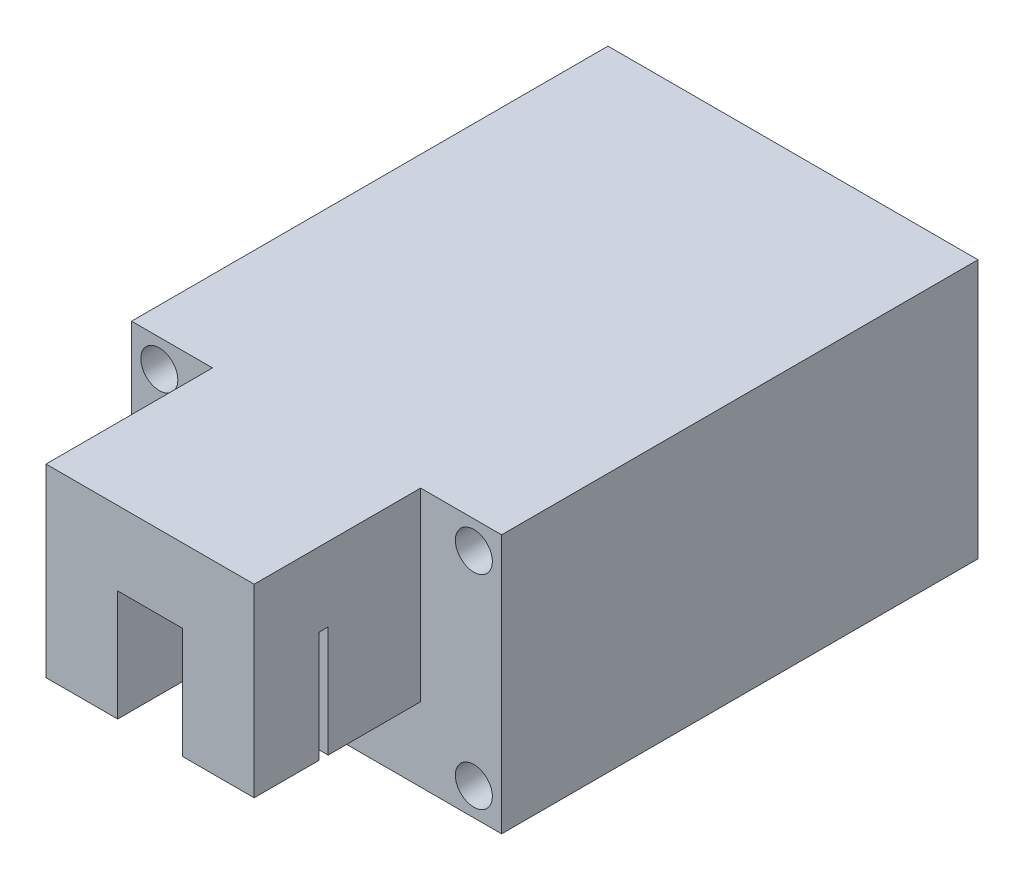
ISO-10303-21;
HEADER;
FILE_DESCRIPTION(('STEP AP214'),'2;1');
FILE_NAME('part.step','',(''),(''),'','','');
FILE_SCHEMA(('AUTOMOTIVE_DESIGN { 1 0 10303 214 1 1 1 1 }'));
ENDSEC;
DATA;
#1=APPLICATION_CONTEXT('core data for automotive mechanical design processes');
#2=APPLICATION_PROTOCOL_DEFINITION('international standard','automotive_design',2000,#1);
#3=PRODUCT_CONTEXT('',#1,'mechanical');
#4=PRODUCT('Part','Part','',(#3));
#5=PRODUCT_RELATED_PRODUCT_CATEGORY('part','',(#4));
#6=PRODUCT_DEFINITION_FORMATION('','',#4);
#7=PRODUCT_DEFINITION_CONTEXT('part definition',#1,'design');
#8=PRODUCT_DEFINITION('design','',#6,#7);
#9=PRODUCT_DEFINITION_SHAPE('','',#8);
#10=(LENGTH_UNIT() NAMED_UNIT(*) SI_UNIT(.MILLI.,.METRE.));
#11=(NAMED_UNIT(*) PLANE_ANGLE_UNIT() SI_UNIT($,.RADIAN.));
#12=(NAMED_UNIT(*) SI_UNIT($,.STERADIAN.) SOLID_ANGLE_UNIT());
#13=UNCERTAINTY_MEASURE_WITH_UNIT(LENGTH_MEASURE(1.E-05),#10,'distance_accuracy_value','');
#14=(GEOMETRIC_REPRESENTATION_CONTEXT(3) GLOBAL_UNCERTAINTY_ASSIGNED_CONTEXT((#13)) GLOBAL_UNIT_ASSIGNED_CONTEXT((#10,
#11,#12)) REPRESENTATION_CONTEXT('',''));
#15=CARTESIAN_POINT('',(0.,0.,0.));
#16=DIRECTION('',(0.,0.,1.));
#17=DIRECTION('',(1.,0.,0.));
#18=AXIS2_PLACEMENT_3D('',#15,#16,#17);
#19=CARTESIAN_POINT('',(-11.25,-6.,69.5));
#20=DIRECTION('',(0.,1.,0.));
#21=DIRECTION('',(0.,0.,1.));
#22=AXIS2_PLACEMENT_3D('',#19,#20,#21);
#23=PLANE('',#22);
#24=DIRECTION('',(-1.,0.,0.));
#25=VECTOR('',#24,1.);
#26=CARTESIAN_POINT('',(-11.25,-6.,62.5));
#27=LINE('',#26,#25);
#28=CARTESIAN_POINT('',(-3.5,-6.,62.5));
#29=VERTEX_POINT('',#28);
#30=CARTESIAN_POINT('',(-11.25,-6.,62.5));
#31=VERTEX_POINT('',#30);
#32=EDGE_CURVE('E183',#29,#31,#27,.T.);
#33=ORIENTED_EDGE('',*,*,#32,.F.);
#34=DIRECTION('',(0.,0.,1.));
#35=VECTOR('',#34,1.);
#36=CARTESIAN_POINT('',(-3.5,-6.,62.5));
#37=LINE('',#36,#35);
#38=CARTESIAN_POINT('',(-3.5,-6.,69.5));
#39=VERTEX_POINT('',#38);
#40=EDGE_CURVE('E169',#29,#39,#37,.T.);
#41=ORIENTED_EDGE('',*,*,#40,.T.);
#42=DIRECTION('',(1.,0.,0.));
#43=VECTOR('',#42,1.);
#44=CARTESIAN_POINT('',(-11.25,-6.,69.5));
#45=LINE('',#44,#43);
#46=CARTESIAN_POINT('',(-11.25,-6.,69.5));
#47=VERTEX_POINT('',#46);
#48=EDGE_CURVE('E245',#47,#39,#45,.T.);
#49=ORIENTED_EDGE('',*,*,#48,.F.);
#50=DIRECTION('',(0.,0.,-1.));
#51=VECTOR('',#50,1.);
#52=CARTESIAN_POINT('',(-11.25,-6.,69.5));
#53=LINE('',#52,#51);
#54=EDGE_CURVE('E190',#47,#31,#53,.T.);
#55=ORIENTED_EDGE('',*,*,#54,.T.);
#56=EDGE_LOOP('',(#33,#41,#49,#55));
#57=FACE_BOUND('',#56,.T.);
#58=ADVANCED_FACE('F32',(#57),#23,.F.);
#59=CARTESIAN_POINT('',(-11.25,6.,62.5));
#60=DIRECTION('',(0.,0.,1.));
#61=DIRECTION('',(1.,0.,0.));
#62=AXIS2_PLACEMENT_3D('',#59,#60,#61);
#63=PLANE('',#62);
#64=DIRECTION('',(-1.,0.,0.));
#65=VECTOR('',#64,1.);
#66=CARTESIAN_POINT('',(-11.25,6.,62.5));
#67=LINE('',#66,#65);
#68=CARTESIAN_POINT('',(-3.5,6.,62.5));
#69=VERTEX_POINT('',#68);
#70=CARTESIAN_POINT('',(-11.25,6.,62.5));
#71=VERTEX_POINT('',#70);
#72=EDGE_CURVE('E185',#69,#71,#67,.T.);
#73=ORIENTED_EDGE('',*,*,#72,.F.);
#74=DIRECTION('',(0.,-1.,0.));
#75=VECTOR('',#74,1.);
#76=CARTESIAN_POINT('',(-3.5,-6.,62.5));
#77=LINE('',#76,#75);
#78=EDGE_CURVE('E49',#69,#29,#77,.T.);
#79=ORIENTED_EDGE('',*,*,#78,.T.);
#80=ORIENTED_EDGE('',*,*,#32,.T.);
#81=DIRECTION('',(0.,-1.,0.));
#82=VECTOR('',#81,1.);
#83=CARTESIAN_POINT('',(-11.25,6.,62.5));
#84=LINE('',#83,#82);
#85=EDGE_CURVE('E200',#71,#31,#84,.T.);
#86=ORIENTED_EDGE('',*,*,#85,.F.);
#87=EDGE_LOOP('',(#73,#79,#80,#86));
#88=FACE_BOUND('',#87,.T.);
#89=ADVANCED_FACE('F181',(#88),#63,.F.);
#90=CARTESIAN_POINT('',(3.5,-6.,69.5));
#91=VERTEX_POINT('',#90);
#92=CARTESIAN_POINT('',(11.25,-6.,69.5));
#93=VERTEX_POINT('',#92);
#94=EDGE_CURVE('E243',#91,#93,#45,.T.);
#95=ORIENTED_EDGE('',*,*,#94,.F.);
#96=DIRECTION('',(0.,0.,1.));
#97=VECTOR('',#96,1.);
#98=CARTESIAN_POINT('',(3.5,-6.,62.5));
#99=LINE('',#98,#97);
#100=CARTESIAN_POINT('',(3.5,-6.,62.5));
#101=VERTEX_POINT('',#100);
#102=EDGE_CURVE('E176',#101,#91,#99,.T.);
#103=ORIENTED_EDGE('',*,*,#102,.F.);
#104=CARTESIAN_POINT('',(11.25,-6.,62.5));
#105=VERTEX_POINT('',#104);
#106=EDGE_CURVE('E191',#105,#101,#27,.T.);
#107=ORIENTED_EDGE('',*,*,#106,.F.);
#108=DIRECTION('',(0.,0.,-1.));
#109=VECTOR('',#108,1.);
#110=CARTESIAN_POINT('',(11.25,-6.,69.5));
#111=LINE('',#110,#109);
#112=EDGE_CURVE('E258',#93,#105,#111,.T.);
#113=ORIENTED_EDGE('',*,*,#112,.F.);
#114=EDGE_LOOP('',(#95,#103,#107,#113));
#115=FACE_BOUND('',#114,.T.);
#116=ADVANCED_FACE('F409',(#115),#23,.F.);
#117=CARTESIAN_POINT('',(0.,0.,51.5));
#118=DIRECTION('',(0.,0.,-1.));
#119=DIRECTION('',(-1.,0.,0.));
#120=AXIS2_PLACEMENT_3D('',#117,#118,#119);
#121=PLANE('',#120);
#122=CARTESIAN_POINT('',(17.,-11.,51.5));
#123=DIRECTION('',(0.,0.,1.));
#124=DIRECTION('',(1.,0.,0.));
#125=AXIS2_PLACEMENT_3D('',#122,#123,#124);
#126=CIRCLE('',#125,2.);
#127=CARTESIAN_POINT('',(19.,-11.,51.5));
#128=VERTEX_POINT('',#127);
#129=EDGE_CURVE('E370',#128,#128,#126,.T.);
#130=ORIENTED_EDGE('',*,*,#129,.F.);
#131=EDGE_LOOP('',(#130));
#132=FACE_BOUND('',#131,.T.);
#133=CARTESIAN_POINT('',(17.,11.,51.5));
#134=DIRECTION('',(0.,0.,1.));
#135=DIRECTION('',(1.,0.,0.));
#136=AXIS2_PLACEMENT_3D('',#133,#134,#135);
#137=CIRCLE('',#136,2.);
#138=CARTESIAN_POINT('',(19.,11.,51.5));
#139=VERTEX_POINT('',#138);
#140=EDGE_CURVE('E382',#139,#139,#137,.T.);
#141=ORIENTED_EDGE('',*,*,#140,.F.);
#142=EDGE_LOOP('',(#141));
#143=FACE_BOUND('',#142,.T.);
#144=CARTESIAN_POINT('',(-17.,11.,51.5));
#145=DIRECTION('',(0.,0.,1.));
#146=DIRECTION('',(1.,0.,0.));
#147=AXIS2_PLACEMENT_3D('',#144,#145,#146);
#148=CIRCLE('',#147,2.);
#149=CARTESIAN_POINT('',(-15.,11.,51.5));
#150=VERTEX_POINT('',#149);
#151=EDGE_CURVE('E299',#150,#150,#148,.T.);
#152=ORIENTED_EDGE('',*,*,#151,.F.);
#153=EDGE_LOOP('',(#152));
#154=FACE_BOUND('',#153,.T.);
#155=CARTESIAN_POINT('',(-17.,-11.,51.5));
#156=DIRECTION('',(0.,0.,1.));
#157=DIRECTION('',(1.,0.,0.));
#158=AXIS2_PLACEMENT_3D('',#155,#156,#157);
#159=CIRCLE('',#158,2.);
#160=CARTESIAN_POINT('',(-15.,-11.,51.5));
#161=VERTEX_POINT('',#160);
#162=EDGE_CURVE('E376',#161,#161,#159,.T.);
#163=ORIENTED_EDGE('',*,*,#162,.F.);
#164=EDGE_LOOP('',(#163));
#165=FACE_BOUND('',#164,.T.);
#166=DIRECTION('',(0.,-1.,0.));
#167=VECTOR('',#166,1.);
#168=CARTESIAN_POINT('',(-11.25,14.,51.5));
#169=LINE('',#168,#167);
#170=CARTESIAN_POINT('',(-11.25,14.,51.5));
#171=VERTEX_POINT('',#170);
#172=CARTESIAN_POINT('',(-11.25,-6.,51.5));
#173=VERTEX_POINT('',#172);
#174=EDGE_CURVE('E233',#171,#173,#169,.T.);
#175=ORIENTED_EDGE('',*,*,#174,.F.);
#176=DIRECTION('',(-1.,0.,0.));
#177=VECTOR('',#176,1.);
#178=CARTESIAN_POINT('',(-20.,14.,51.5));
#179=LINE('',#178,#177);
#180=CARTESIAN_POINT('',(-20.,14.,51.5));
#181=VERTEX_POINT('',#180);
#182=EDGE_CURVE('E280',#171,#181,#179,.T.);
#183=ORIENTED_EDGE('',*,*,#182,.T.);
#184=DIRECTION('',(0.,-1.,0.));
#185=VECTOR('',#184,1.);
#186=CARTESIAN_POINT('',(-20.,-14.,51.5));
#187=LINE('',#186,#185);
#188=CARTESIAN_POINT('',(-20.,-14.,51.5));
#189=VERTEX_POINT('',#188);
#190=EDGE_CURVE('E289',#181,#189,#187,.T.);
#191=ORIENTED_EDGE('',*,*,#190,.T.);
#192=DIRECTION('',(1.,0.,0.));
#193=VECTOR('',#192,1.);
#194=CARTESIAN_POINT('',(-20.,-14.,51.5));
#195=LINE('',#194,#193);
#196=CARTESIAN_POINT('',(20.,-14.,51.5));
#197=VERTEX_POINT('',#196);
#198=EDGE_CURVE('E292',#189,#197,#195,.T.);
#199=ORIENTED_EDGE('',*,*,#198,.T.);
#200=DIRECTION('',(0.,1.,0.));
#201=VECTOR('',#200,1.);
#202=CARTESIAN_POINT('',(20.,-14.,51.5));
#203=LINE('',#202,#201);
#204=CARTESIAN_POINT('',(20.,14.,51.5));
#205=VERTEX_POINT('',#204);
#206=EDGE_CURVE('E284',#197,#205,#203,.T.);
#207=ORIENTED_EDGE('',*,*,#206,.T.);
#208=CARTESIAN_POINT('',(11.25,14.,51.5));
#209=VERTEX_POINT('',#208);
#210=EDGE_CURVE('E283',#205,#209,#179,.T.);
#211=ORIENTED_EDGE('',*,*,#210,.T.);
#212=DIRECTION('',(0.,1.,0.));
#213=VECTOR('',#212,1.);
#214=CARTESIAN_POINT('',(11.25,14.,51.5));
#215=LINE('',#214,#213);
#216=CARTESIAN_POINT('',(11.25,-6.,51.5));
#217=VERTEX_POINT('',#216);
#218=EDGE_CURVE('E244',#217,#209,#215,.T.);
#219=ORIENTED_EDGE('',*,*,#218,.F.);
#220=DIRECTION('',(1.,0.,0.));
#221=VECTOR('',#220,1.);
#222=CARTESIAN_POINT('',(-11.25,-6.,51.5));
#223=LINE('',#222,#221);
#224=CARTESIAN_POINT('',(6.75,-6.,51.5));
#225=VERTEX_POINT('',#224);
#226=EDGE_CURVE('E255',#225,#217,#223,.T.);
#227=ORIENTED_EDGE('',*,*,#226,.F.);
#228=DIRECTION('',(0.,-1.,0.));
#229=VECTOR('',#228,1.);
#230=CARTESIAN_POINT('',(6.75,6.,51.5));
#231=LINE('',#230,#229);
#232=CARTESIAN_POINT('',(6.75,6.,51.5));
#233=VERTEX_POINT('',#232);
#234=EDGE_CURVE('E236',#233,#225,#231,.T.);
#235=ORIENTED_EDGE('',*,*,#234,.F.);
#236=DIRECTION('',(1.,0.,0.));
#237=VECTOR('',#236,1.);
#238=CARTESIAN_POINT('',(-6.75,6.,51.5));
#239=LINE('',#238,#237);
#240=CARTESIAN_POINT('',(-6.75,6.,51.5));
#241=VERTEX_POINT('',#240);
#242=EDGE_CURVE('E214',#241,#233,#239,.T.);
#243=ORIENTED_EDGE('',*,*,#242,.F.);
#244=DIRECTION('',(0.,-1.,0.));
#245=VECTOR('',#244,1.);
#246=CARTESIAN_POINT('',(-6.75,6.,51.5));
#247=LINE('',#246,#245);
#248=CARTESIAN_POINT('',(-6.75,-6.,51.5));
#249=VERTEX_POINT('',#248);
#250=EDGE_CURVE('E224',#241,#249,#247,.T.);
#251=ORIENTED_EDGE('',*,*,#250,.T.);
#252=EDGE_CURVE('E252',#173,#249,#223,.T.);
#253=ORIENTED_EDGE('',*,*,#252,.F.);
#254=EDGE_LOOP('',(#175,#183,#191,#199,#207,#211,#219,#227,#235,#243,#251,#253));
#255=FACE_BOUND('',#254,.T.);
#256=ADVANCED_FACE('F332',(#132,#143,#154,#165,#255),#121,.F.);
#257=CARTESIAN_POINT('',(0.,0.,0.));
#258=DIRECTION('',(0.,0.,-1.));
#259=DIRECTION('',(-1.,0.,0.));
#260=AXIS2_PLACEMENT_3D('',#257,#258,#259);
#261=PLANE('',#260);
#262=CARTESIAN_POINT('',(-17.,-11.,0.));
#263=DIRECTION('',(0.,0.,1.));
#264=DIRECTION('',(1.,0.,0.));
#265=AXIS2_PLACEMENT_3D('',#262,#263,#264);
#266=CIRCLE('',#265,2.);
#267=CARTESIAN_POINT('',(-15.,-11.,0.));
#268=VERTEX_POINT('',#267);
#269=EDGE_CURVE('E373',#268,#268,#266,.T.);
#270=ORIENTED_EDGE('',*,*,#269,.T.);
#271=EDGE_LOOP('',(#270));
#272=FACE_BOUND('',#271,.T.);
#273=CARTESIAN_POINT('',(-17.,11.,0.));
#274=DIRECTION('',(0.,0.,1.));
#275=DIRECTION('',(1.,0.,0.));
#276=AXIS2_PLACEMENT_3D('',#273,#274,#275);
#277=CIRCLE('',#276,2.);
#278=CARTESIAN_POINT('',(-15.,11.,0.));
#279=VERTEX_POINT('',#278);
#280=EDGE_CURVE('E385',#279,#279,#277,.T.);
#281=ORIENTED_EDGE('',*,*,#280,.T.);
#282=EDGE_LOOP('',(#281));
#283=FACE_BOUND('',#282,.T.);
#284=DIRECTION('',(0.,1.,0.));
#285=VECTOR('',#284,1.);
#286=CARTESIAN_POINT('',(20.,-14.,0.));
#287=LINE('',#286,#285);
#288=CARTESIAN_POINT('',(20.,-14.,0.));
#289=VERTEX_POINT('',#288);
#290=CARTESIAN_POINT('',(20.,14.,0.));
#291=VERTEX_POINT('',#290);
#292=EDGE_CURVE('E295',#289,#291,#287,.T.);
#293=ORIENTED_EDGE('',*,*,#292,.F.);
#294=DIRECTION('',(1.,0.,0.));
#295=VECTOR('',#294,1.);
#296=CARTESIAN_POINT('',(-20.,-14.,0.));
#297=LINE('',#296,#295);
#298=CARTESIAN_POINT('',(-20.,-14.,0.));
#299=VERTEX_POINT('',#298);
#300=EDGE_CURVE('E303',#299,#289,#297,.T.);
#301=ORIENTED_EDGE('',*,*,#300,.F.);
#302=DIRECTION('',(0.,-1.,0.));
#303=VECTOR('',#302,1.);
#304=CARTESIAN_POINT('',(-20.,-14.,0.));
#305=LINE('',#304,#303);
#306=CARTESIAN_POINT('',(-20.,14.,0.));
#307=VERTEX_POINT('',#306);
#308=EDGE_CURVE('E301',#307,#299,#305,.T.);
#309=ORIENTED_EDGE('',*,*,#308,.F.);
#310=DIRECTION('',(-1.,0.,0.));
#311=VECTOR('',#310,1.);
#312=CARTESIAN_POINT('',(-20.,14.,0.));
#313=LINE('',#312,#311);
#314=EDGE_CURVE('E298',#291,#307,#313,.T.);
#315=ORIENTED_EDGE('',*,*,#314,.F.);
#316=EDGE_LOOP('',(#293,#301,#309,#315));
#317=FACE_BOUND('',#316,.T.);
#318=CARTESIAN_POINT('',(17.,11.,0.));
#319=DIRECTION('',(0.,0.,1.));
#320=DIRECTION('',(1.,0.,0.));
#321=AXIS2_PLACEMENT_3D('',#318,#319,#320);
#322=CIRCLE('',#321,2.);
#323=CARTESIAN_POINT('',(19.,11.,0.));
#324=VERTEX_POINT('',#323);
#325=EDGE_CURVE('E379',#324,#324,#322,.T.);
#326=ORIENTED_EDGE('',*,*,#325,.T.);
#327=EDGE_LOOP('',(#326));
#328=FACE_BOUND('',#327,.T.);
#329=CARTESIAN_POINT('',(17.,-11.,0.));
#330=DIRECTION('',(0.,0.,1.));
#331=DIRECTION('',(1.,0.,0.));
#332=AXIS2_PLACEMENT_3D('',#329,#330,#331);
#333=CIRCLE('',#332,2.);
#334=CARTESIAN_POINT('',(19.,-11.,0.));
#335=VERTEX_POINT('',#334);
#336=EDGE_CURVE('E368',#335,#335,#333,.T.);
#337=ORIENTED_EDGE('',*,*,#336,.T.);
#338=EDGE_LOOP('',(#337));
#339=FACE_BOUND('',#338,.T.);
#340=ADVANCED_FACE('F321',(#272,#283,#317,#328,#339),#261,.T.);
#341=CARTESIAN_POINT('',(20.,-14.,51.5));
#342=DIRECTION('',(-1.,0.,0.));
#343=DIRECTION('',(0.,0.,1.));
#344=AXIS2_PLACEMENT_3D('',#341,#342,#343);
#345=PLANE('',#344);
#346=ORIENTED_EDGE('',*,*,#292,.T.);
#347=DIRECTION('',(0.,0.,-1.));
#348=VECTOR('',#347,1.);
#349=CARTESIAN_POINT('',(20.,14.,51.5));
#350=LINE('',#349,#348);
#351=EDGE_CURVE('E11',#205,#291,#350,.T.);
#352=ORIENTED_EDGE('',*,*,#351,.F.);
#353=ORIENTED_EDGE('',*,*,#206,.F.);
#354=DIRECTION('',(0.,0.,-1.));
#355=VECTOR('',#354,1.);
#356=CARTESIAN_POINT('',(20.,-14.,51.5));
#357=LINE('',#356,#355);
#358=EDGE_CURVE('E294',#197,#289,#357,.T.);
#359=ORIENTED_EDGE('',*,*,#358,.T.);
#360=EDGE_LOOP('',(#346,#352,#353,#359));
#361=FACE_BOUND('',#360,.T.);
#362=ADVANCED_FACE('F34',(#361),#345,.F.);
#363=CARTESIAN_POINT('',(-20.,14.,51.5));
#364=DIRECTION('',(0.,-1.,0.));
#365=DIRECTION('',(0.,0.,-1.));
#366=AXIS2_PLACEMENT_3D('',#363,#364,#365);
#367=PLANE('',#366);
#368=ORIENTED_EDGE('',*,*,#314,.T.);
#369=DIRECTION('',(0.,0.,-1.));
#370=VECTOR('',#369,1.);
#371=CARTESIAN_POINT('',(-20.,14.,51.5));
#372=LINE('',#371,#370);
#373=EDGE_CURVE('E41',#181,#307,#372,.T.);
#374=ORIENTED_EDGE('',*,*,#373,.F.);
#375=ORIENTED_EDGE('',*,*,#182,.F.);
#376=DIRECTION('',(0.,0.,-1.));
#377=VECTOR('',#376,1.);
#378=CARTESIAN_POINT('',(-11.25,14.,69.5));
#379=LINE('',#378,#377);
#380=CARTESIAN_POINT('',(-11.25,14.,69.5));
#381=VERTEX_POINT('',#380);
#382=EDGE_CURVE('E251',#381,#171,#379,.T.);
#383=ORIENTED_EDGE('',*,*,#382,.F.);
#384=DIRECTION('',(-1.,0.,0.));
#385=VECTOR('',#384,1.);
#386=CARTESIAN_POINT('',(-11.25,14.,69.5));
#387=LINE('',#386,#385);
#388=CARTESIAN_POINT('',(11.25,14.,69.5));
#389=VERTEX_POINT('',#388);
#390=EDGE_CURVE('E249',#389,#381,#387,.T.);
#391=ORIENTED_EDGE('',*,*,#390,.F.);
#392=DIRECTION('',(0.,0.,-1.));
#393=VECTOR('',#392,1.);
#394=CARTESIAN_POINT('',(11.25,14.,69.5));
#395=LINE('',#394,#393);
#396=EDGE_CURVE('E265',#389,#209,#395,.T.);
#397=ORIENTED_EDGE('',*,*,#396,.T.);
#398=ORIENTED_EDGE('',*,*,#210,.F.);
#399=ORIENTED_EDGE('',*,*,#351,.T.);
#400=EDGE_LOOP('',(#368,#374,#375,#383,#391,#397,#398,#399));
#401=FACE_BOUND('',#400,.T.);
#402=ADVANCED_FACE('F335',(#401),#367,.F.);
#403=CARTESIAN_POINT('',(-20.,-14.,51.5));
#404=DIRECTION('',(1.,0.,0.));
#405=DIRECTION('',(0.,0.,-1.));
#406=AXIS2_PLACEMENT_3D('',#403,#404,#405);
#407=PLANE('',#406);
#408=ORIENTED_EDGE('',*,*,#308,.T.);
#409=DIRECTION('',(0.,0.,-1.));
#410=VECTOR('',#409,1.);
#411=CARTESIAN_POINT('',(-20.,-14.,51.5));
#412=LINE('',#411,#410);
#413=EDGE_CURVE('E307',#189,#299,#412,.T.);
#414=ORIENTED_EDGE('',*,*,#413,.F.);
#415=ORIENTED_EDGE('',*,*,#190,.F.);
#416=ORIENTED_EDGE('',*,*,#373,.T.);
#417=EDGE_LOOP('',(#408,#414,#415,#416));
#418=FACE_BOUND('',#417,.T.);
#419=ADVANCED_FACE('F315',(#418),#407,.F.);
#420=CARTESIAN_POINT('',(-20.,-14.,51.5));
#421=DIRECTION('',(0.,1.,0.));
#422=DIRECTION('',(0.,0.,1.));
#423=AXIS2_PLACEMENT_3D('',#420,#421,#422);
#424=PLANE('',#423);
#425=ORIENTED_EDGE('',*,*,#300,.T.);
#426=ORIENTED_EDGE('',*,*,#358,.F.);
#427=ORIENTED_EDGE('',*,*,#198,.F.);
#428=ORIENTED_EDGE('',*,*,#413,.T.);
#429=EDGE_LOOP('',(#425,#426,#427,#428));
#430=FACE_BOUND('',#429,.T.);
#431=ADVANCED_FACE('F325',(#430),#424,.F.);
#432=CARTESIAN_POINT('',(-17.,11.,51.5));
#433=DIRECTION('',(0.,0.,-1.));
#434=DIRECTION('',(-1.,0.,0.));
#435=AXIS2_PLACEMENT_3D('',#432,#433,#434);
#436=CYLINDRICAL_SURFACE('',#435,2.);
#437=ORIENTED_EDGE('',*,*,#151,.T.);
#438=EDGE_LOOP('',(#437));
#439=FACE_BOUND('',#438,.T.);
#440=ORIENTED_EDGE('',*,*,#280,.F.);
#441=EDGE_LOOP('',(#440));
#442=FACE_BOUND('',#441,.T.);
#443=ADVANCED_FACE('F393',(#439,#442),#436,.F.);
#444=CARTESIAN_POINT('',(17.,11.,51.5));
#445=DIRECTION('',(0.,0.,-1.));
#446=DIRECTION('',(-1.,0.,0.));
#447=AXIS2_PLACEMENT_3D('',#444,#445,#446);
#448=CYLINDRICAL_SURFACE('',#447,2.);
#449=ORIENTED_EDGE('',*,*,#140,.T.);
#450=EDGE_LOOP('',(#449));
#451=FACE_BOUND('',#450,.T.);
#452=ORIENTED_EDGE('',*,*,#325,.F.);
#453=EDGE_LOOP('',(#452));
#454=FACE_BOUND('',#453,.T.);
#455=ADVANCED_FACE('F395',(#451,#454),#448,.F.);
#456=CARTESIAN_POINT('',(-17.,-11.,51.5));
#457=DIRECTION('',(0.,0.,-1.));
#458=DIRECTION('',(-1.,0.,0.));
#459=AXIS2_PLACEMENT_3D('',#456,#457,#458);
#460=CYLINDRICAL_SURFACE('',#459,2.);
#461=ORIENTED_EDGE('',*,*,#162,.T.);
#462=EDGE_LOOP('',(#461));
#463=FACE_BOUND('',#462,.T.);
#464=ORIENTED_EDGE('',*,*,#269,.F.);
#465=EDGE_LOOP('',(#464));
#466=FACE_BOUND('',#465,.T.);
#467=ADVANCED_FACE('F402',(#463,#466),#460,.F.);
#468=CARTESIAN_POINT('',(17.,-11.,51.5));
#469=DIRECTION('',(0.,0.,-1.));
#470=DIRECTION('',(-1.,0.,0.));
#471=AXIS2_PLACEMENT_3D('',#468,#469,#470);
#472=CYLINDRICAL_SURFACE('',#471,2.);
#473=ORIENTED_EDGE('',*,*,#129,.T.);
#474=EDGE_LOOP('',(#473));
#475=FACE_BOUND('',#474,.T.);
#476=ORIENTED_EDGE('',*,*,#336,.F.);
#477=EDGE_LOOP('',(#476));
#478=FACE_BOUND('',#477,.T.);
#479=ADVANCED_FACE('F424',(#475,#478),#472,.F.);
#480=CARTESIAN_POINT('',(-11.25,14.,69.5));
#481=DIRECTION('',(1.,0.,0.));
#482=DIRECTION('',(0.,1.,0.));
#483=AXIS2_PLACEMENT_3D('',#480,#481,#482);
#484=PLANE('',#483);
#485=DIRECTION('',(0.,0.,-1.));
#486=VECTOR('',#485,1.);
#487=CARTESIAN_POINT('',(-11.25,6.,61.5));
#488=LINE('',#487,#486);
#489=CARTESIAN_POINT('',(-11.25,6.,61.5));
#490=VERTEX_POINT('',#489);
#491=EDGE_CURVE('E195',#71,#490,#488,.T.);
#492=ORIENTED_EDGE('',*,*,#491,.F.);
#493=ORIENTED_EDGE('',*,*,#85,.T.);
#494=ORIENTED_EDGE('',*,*,#54,.F.);
#495=DIRECTION('',(0.,-1.,0.));
#496=VECTOR('',#495,1.);
#497=CARTESIAN_POINT('',(-11.25,14.,69.5));
#498=LINE('',#497,#496);
#499=EDGE_CURVE('E240',#381,#47,#498,.T.);
#500=ORIENTED_EDGE('',*,*,#499,.F.);
#501=ORIENTED_EDGE('',*,*,#382,.T.);
#502=ORIENTED_EDGE('',*,*,#174,.T.);
#503=CARTESIAN_POINT('',(-11.25,-6.,61.5));
#504=VERTEX_POINT('',#503);
#505=EDGE_CURVE('E366',#504,#173,#53,.T.);
#506=ORIENTED_EDGE('',*,*,#505,.F.);
#507=DIRECTION('',(0.,-1.,0.));
#508=VECTOR('',#507,1.);
#509=CARTESIAN_POINT('',(-11.25,6.,61.5));
#510=LINE('',#509,#508);
#511=EDGE_CURVE('E208',#490,#504,#510,.T.);
#512=ORIENTED_EDGE('',*,*,#511,.F.);
#513=EDGE_LOOP('',(#492,#493,#494,#500,#501,#502,#506,#512));
#514=FACE_BOUND('',#513,.T.);
#515=ADVANCED_FACE('F337',(#514),#484,.F.);
#516=CARTESIAN_POINT('',(11.25,-6.,61.5));
#517=VERTEX_POINT('',#516);
#518=EDGE_CURVE('E267',#517,#217,#111,.T.);
#519=ORIENTED_EDGE('',*,*,#518,.F.);
#520=DIRECTION('',(1.,0.,0.));
#521=VECTOR('',#520,1.);
#522=CARTESIAN_POINT('',(-11.25,-6.,61.5));
#523=LINE('',#522,#521);
#524=EDGE_CURVE('E192',#504,#517,#523,.T.);
#525=ORIENTED_EDGE('',*,*,#524,.F.);
#526=ORIENTED_EDGE('',*,*,#505,.T.);
#527=ORIENTED_EDGE('',*,*,#252,.T.);
#528=DIRECTION('',(0.,0.,-1.));
#529=VECTOR('',#528,1.);
#530=CARTESIAN_POINT('',(-6.75,-6.,51.5));
#531=LINE('',#530,#529);
#532=CARTESIAN_POINT('',(-6.75,-6.,58.5));
#533=VERTEX_POINT('',#532);
#534=EDGE_CURVE('E202',#533,#249,#531,.T.);
#535=ORIENTED_EDGE('',*,*,#534,.F.);
#536=DIRECTION('',(-1.,0.,0.));
#537=VECTOR('',#536,1.);
#538=CARTESIAN_POINT('',(-6.75,-6.,58.5));
#539=LINE('',#538,#537);
#540=CARTESIAN_POINT('',(6.75,-6.,58.5));
#541=VERTEX_POINT('',#540);
#542=EDGE_CURVE('E215',#541,#533,#539,.T.);
#543=ORIENTED_EDGE('',*,*,#542,.F.);
#544=DIRECTION('',(0.,0.,1.));
#545=VECTOR('',#544,1.);
#546=CARTESIAN_POINT('',(6.75,-6.,51.5));
#547=LINE('',#546,#545);
#548=EDGE_CURVE('E226',#225,#541,#547,.T.);
#549=ORIENTED_EDGE('',*,*,#548,.F.);
#550=ORIENTED_EDGE('',*,*,#226,.T.);
#551=EDGE_LOOP('',(#519,#525,#526,#527,#535,#543,#549,#550));
#552=FACE_BOUND('',#551,.T.);
#553=ADVANCED_FACE('F354',(#552),#23,.F.);
#554=CARTESIAN_POINT('',(11.25,14.,69.5));
#555=DIRECTION('',(-1.,0.,0.));
#556=DIRECTION('',(0.,-1.,0.));
#557=AXIS2_PLACEMENT_3D('',#554,#555,#556);
#558=PLANE('',#557);
#559=ORIENTED_EDGE('',*,*,#112,.T.);
#560=DIRECTION('',(0.,-1.,0.));
#561=VECTOR('',#560,1.);
#562=CARTESIAN_POINT('',(11.25,6.,62.5));
#563=LINE('',#562,#561);
#564=CARTESIAN_POINT('',(11.25,6.,62.5));
#565=VERTEX_POINT('',#564);
#566=EDGE_CURVE('E203',#565,#105,#563,.T.);
#567=ORIENTED_EDGE('',*,*,#566,.F.);
#568=DIRECTION('',(0.,0.,1.));
#569=VECTOR('',#568,1.);
#570=CARTESIAN_POINT('',(11.25,6.,61.5));
#571=LINE('',#570,#569);
#572=CARTESIAN_POINT('',(11.25,6.,61.5));
#573=VERTEX_POINT('',#572);
#574=EDGE_CURVE('E623',#573,#565,#571,.T.);
#575=ORIENTED_EDGE('',*,*,#574,.F.);
#576=DIRECTION('',(0.,-1.,0.));
#577=VECTOR('',#576,1.);
#578=CARTESIAN_POINT('',(11.25,6.,61.5));
#579=LINE('',#578,#577);
#580=EDGE_CURVE('E205',#573,#517,#579,.T.);
#581=ORIENTED_EDGE('',*,*,#580,.T.);
#582=ORIENTED_EDGE('',*,*,#518,.T.);
#583=ORIENTED_EDGE('',*,*,#218,.T.);
#584=ORIENTED_EDGE('',*,*,#396,.F.);
#585=DIRECTION('',(0.,1.,0.));
#586=VECTOR('',#585,1.);
#587=CARTESIAN_POINT('',(11.25,14.,69.5));
#588=LINE('',#587,#586);
#589=EDGE_CURVE('E247',#93,#389,#588,.T.);
#590=ORIENTED_EDGE('',*,*,#589,.F.);
#591=EDGE_LOOP('',(#559,#567,#575,#581,#582,#583,#584,#590));
#592=FACE_BOUND('',#591,.T.);
#593=ADVANCED_FACE('F346',(#592),#558,.F.);
#594=CARTESIAN_POINT('',(0.,0.,69.5));
#595=DIRECTION('',(0.,0.,1.));
#596=DIRECTION('',(1.,0.,0.));
#597=AXIS2_PLACEMENT_3D('',#594,#595,#596);
#598=PLANE('',#597);
#599=DIRECTION('',(0.,-1.,0.));
#600=VECTOR('',#599,1.);
#601=CARTESIAN_POINT('',(-3.5,-6.,69.5));
#602=LINE('',#601,#600);
#603=CARTESIAN_POINT('',(-3.5,6.,69.5));
#604=VERTEX_POINT('',#603);
#605=EDGE_CURVE('E172',#604,#39,#602,.T.);
#606=ORIENTED_EDGE('',*,*,#605,.F.);
#607=DIRECTION('',(-1.,0.,0.));
#608=VECTOR('',#607,1.);
#609=CARTESIAN_POINT('',(-3.5,6.,69.5));
#610=LINE('',#609,#608);
#611=CARTESIAN_POINT('',(3.5,6.,69.5));
#612=VERTEX_POINT('',#611);
#613=EDGE_CURVE('E186',#612,#604,#610,.T.);
#614=ORIENTED_EDGE('',*,*,#613,.F.);
#615=DIRECTION('',(0.,1.,0.));
#616=VECTOR('',#615,1.);
#617=CARTESIAN_POINT('',(3.5,-6.,69.5));
#618=LINE('',#617,#616);
#619=EDGE_CURVE('E637',#91,#612,#618,.T.);
#620=ORIENTED_EDGE('',*,*,#619,.F.);
#621=ORIENTED_EDGE('',*,*,#94,.T.);
#622=ORIENTED_EDGE('',*,*,#589,.T.);
#623=ORIENTED_EDGE('',*,*,#390,.T.);
#624=ORIENTED_EDGE('',*,*,#499,.T.);
#625=ORIENTED_EDGE('',*,*,#48,.T.);
#626=EDGE_LOOP('',(#606,#614,#620,#621,#622,#623,#624,#625));
#627=FACE_BOUND('',#626,.T.);
#628=ADVANCED_FACE('F339',(#627),#598,.T.);
#629=CARTESIAN_POINT('',(-6.75,6.,51.5));
#630=DIRECTION('',(-1.,0.,0.));
#631=DIRECTION('',(0.,0.,1.));
#632=AXIS2_PLACEMENT_3D('',#629,#630,#631);
#633=PLANE('',#632);
#634=ORIENTED_EDGE('',*,*,#534,.T.);
#635=ORIENTED_EDGE('',*,*,#250,.F.);
#636=DIRECTION('',(0.,0.,-1.));
#637=VECTOR('',#636,1.);
#638=CARTESIAN_POINT('',(-6.75,6.,51.5));
#639=LINE('',#638,#637);
#640=CARTESIAN_POINT('',(-6.75,6.,58.5));
#641=VERTEX_POINT('',#640);
#642=EDGE_CURVE('E211',#641,#241,#639,.T.);
#643=ORIENTED_EDGE('',*,*,#642,.F.);
#644=DIRECTION('',(0.,-1.,0.));
#645=VECTOR('',#644,1.);
#646=CARTESIAN_POINT('',(-6.75,6.,58.5));
#647=LINE('',#646,#645);
#648=EDGE_CURVE('E231',#641,#533,#647,.T.);
#649=ORIENTED_EDGE('',*,*,#648,.T.);
#650=EDGE_LOOP('',(#634,#635,#643,#649));
#651=FACE_BOUND('',#650,.T.);
#652=ADVANCED_FACE('F519',(#651),#633,.F.);
#653=CARTESIAN_POINT('',(-6.75,6.,58.5));
#654=DIRECTION('',(0.,0.,1.));
#655=DIRECTION('',(1.,0.,0.));
#656=AXIS2_PLACEMENT_3D('',#653,#654,#655);
#657=PLANE('',#656);
#658=ORIENTED_EDGE('',*,*,#542,.T.);
#659=ORIENTED_EDGE('',*,*,#648,.F.);
#660=DIRECTION('',(-1.,0.,0.));
#661=VECTOR('',#660,1.);
#662=CARTESIAN_POINT('',(-6.75,6.,58.5));
#663=LINE('',#662,#661);
#664=CARTESIAN_POINT('',(6.75,6.,58.5));
#665=VERTEX_POINT('',#664);
#666=EDGE_CURVE('E221',#665,#641,#663,.T.);
#667=ORIENTED_EDGE('',*,*,#666,.F.);
#668=DIRECTION('',(0.,-1.,0.));
#669=VECTOR('',#668,1.);
#670=CARTESIAN_POINT('',(6.75,6.,58.5));
#671=LINE('',#670,#669);
#672=EDGE_CURVE('E234',#665,#541,#671,.T.);
#673=ORIENTED_EDGE('',*,*,#672,.T.);
#674=EDGE_LOOP('',(#658,#659,#667,#673));
#675=FACE_BOUND('',#674,.T.);
#676=ADVANCED_FACE('F574',(#675),#657,.F.);
#677=CARTESIAN_POINT('',(6.75,6.,51.5));
#678=DIRECTION('',(1.,0.,0.));
#679=DIRECTION('',(0.,0.,-1.));
#680=AXIS2_PLACEMENT_3D('',#677,#678,#679);
#681=PLANE('',#680);
#682=ORIENTED_EDGE('',*,*,#548,.T.);
#683=ORIENTED_EDGE('',*,*,#672,.F.);
#684=DIRECTION('',(0.,0.,1.));
#685=VECTOR('',#684,1.);
#686=CARTESIAN_POINT('',(6.75,6.,51.5));
#687=LINE('',#686,#685);
#688=EDGE_CURVE('E218',#233,#665,#687,.T.);
#689=ORIENTED_EDGE('',*,*,#688,.F.);
#690=ORIENTED_EDGE('',*,*,#234,.T.);
#691=EDGE_LOOP('',(#682,#683,#689,#690));
#692=FACE_BOUND('',#691,.T.);
#693=ADVANCED_FACE('F359',(#692),#681,.F.);
#694=CARTESIAN_POINT('',(0.,6.,0.));
#695=DIRECTION('',(0.,1.,0.));
#696=DIRECTION('',(0.,0.,1.));
#697=AXIS2_PLACEMENT_3D('',#694,#695,#696);
#698=PLANE('',#697);
#699=ORIENTED_EDGE('',*,*,#642,.T.);
#700=ORIENTED_EDGE('',*,*,#242,.T.);
#701=ORIENTED_EDGE('',*,*,#688,.T.);
#702=ORIENTED_EDGE('',*,*,#666,.T.);
#703=EDGE_LOOP('',(#699,#700,#701,#702));
#704=FACE_BOUND('',#703,.T.);
#705=ADVANCED_FACE('F362',(#704),#698,.F.);
#706=ORIENTED_EDGE('',*,*,#106,.T.);
#707=DIRECTION('',(0.,1.,0.));
#708=VECTOR('',#707,1.);
#709=CARTESIAN_POINT('',(3.5,-6.,62.5));
#710=LINE('',#709,#708);
#711=CARTESIAN_POINT('',(3.5,6.,62.5));
#712=VERTEX_POINT('',#711);
#713=EDGE_CURVE('E177',#101,#712,#710,.T.);
#714=ORIENTED_EDGE('',*,*,#713,.T.);
#715=EDGE_CURVE('E210',#565,#712,#67,.T.);
#716=ORIENTED_EDGE('',*,*,#715,.F.);
#717=ORIENTED_EDGE('',*,*,#566,.T.);
#718=EDGE_LOOP('',(#706,#714,#716,#717));
#719=FACE_BOUND('',#718,.T.);
#720=ADVANCED_FACE('F414',(#719),#63,.F.);
#721=CARTESIAN_POINT('',(-11.25,6.,61.5));
#722=DIRECTION('',(0.,0.,-1.));
#723=DIRECTION('',(-1.,0.,0.));
#724=AXIS2_PLACEMENT_3D('',#721,#722,#723);
#725=PLANE('',#724);
#726=ORIENTED_EDGE('',*,*,#524,.T.);
#727=ORIENTED_EDGE('',*,*,#580,.F.);
#728=DIRECTION('',(1.,0.,0.));
#729=VECTOR('',#728,1.);
#730=CARTESIAN_POINT('',(-11.25,6.,61.5));
#731=LINE('',#730,#729);
#732=EDGE_CURVE('E57',#490,#573,#731,.T.);
#733=ORIENTED_EDGE('',*,*,#732,.F.);
#734=ORIENTED_EDGE('',*,*,#511,.T.);
#735=EDGE_LOOP('',(#726,#727,#733,#734));
#736=FACE_BOUND('',#735,.T.);
#737=ADVANCED_FACE('F533',(#736),#725,.F.);
#738=CARTESIAN_POINT('',(0.,6.,0.));
#739=DIRECTION('',(0.,1.,0.));
#740=DIRECTION('',(0.,0.,1.));
#741=AXIS2_PLACEMENT_3D('',#738,#739,#740);
#742=PLANE('',#741);
#743=ORIENTED_EDGE('',*,*,#491,.T.);
#744=ORIENTED_EDGE('',*,*,#732,.T.);
#745=ORIENTED_EDGE('',*,*,#574,.T.);
#746=ORIENTED_EDGE('',*,*,#715,.T.);
#747=DIRECTION('',(0.,0.,1.));
#748=VECTOR('',#747,1.);
#749=CARTESIAN_POINT('',(3.5,6.,62.5));
#750=LINE('',#749,#748);
#751=EDGE_CURVE('E630',#712,#612,#750,.T.);
#752=ORIENTED_EDGE('',*,*,#751,.T.);
#753=ORIENTED_EDGE('',*,*,#613,.T.);
#754=DIRECTION('',(0.,0.,1.));
#755=VECTOR('',#754,1.);
#756=CARTESIAN_POINT('',(-3.5,6.,62.5));
#757=LINE('',#756,#755);
#758=EDGE_CURVE('E196',#69,#604,#757,.T.);
#759=ORIENTED_EDGE('',*,*,#758,.F.);
#760=ORIENTED_EDGE('',*,*,#72,.T.);
#761=EDGE_LOOP('',(#743,#744,#745,#746,#752,#753,#759,#760));
#762=FACE_BOUND('',#761,.T.);
#763=ADVANCED_FACE('F541',(#762),#742,.F.);
#764=CARTESIAN_POINT('',(-3.5,-6.,62.5));
#765=DIRECTION('',(-1.,0.,0.));
#766=DIRECTION('',(0.,0.,1.));
#767=AXIS2_PLACEMENT_3D('',#764,#765,#766);
#768=PLANE('',#767);
#769=ORIENTED_EDGE('',*,*,#605,.T.);
#770=ORIENTED_EDGE('',*,*,#40,.F.);
#771=ORIENTED_EDGE('',*,*,#78,.F.);
#772=ORIENTED_EDGE('',*,*,#758,.T.);
#773=EDGE_LOOP('',(#769,#770,#771,#772));
#774=FACE_BOUND('',#773,.T.);
#775=ADVANCED_FACE('F170',(#774),#768,.F.);
#776=CARTESIAN_POINT('',(3.5,-6.,62.5));
#777=DIRECTION('',(1.,0.,0.));
#778=DIRECTION('',(0.,0.,-1.));
#779=AXIS2_PLACEMENT_3D('',#776,#777,#778);
#780=PLANE('',#779);
#781=ORIENTED_EDGE('',*,*,#619,.T.);
#782=ORIENTED_EDGE('',*,*,#751,.F.);
#783=ORIENTED_EDGE('',*,*,#713,.F.);
#784=ORIENTED_EDGE('',*,*,#102,.T.);
#785=EDGE_LOOP('',(#781,#782,#783,#784));
#786=FACE_BOUND('',#785,.T.);
#787=ADVANCED_FACE('F556',(#786),#780,.F.);
#788=CLOSED_SHELL('',(#58,#89,#116,#256,#340,#362,#402,#419,#431,#443,#455,#467,#479,#515,#553,
#593,#628,#652,#676,#693,#705,#720,#737,#763,#775,#787));
#789=MANIFOLD_SOLID_BREP('B2',#788);
#790=ADVANCED_BREP_SHAPE_REPRESENTATION('',(#18,#789),#14);
#791=SHAPE_DEFINITION_REPRESENTATION(#9,#790);
ENDSEC;
END-ISO-10303-21;
